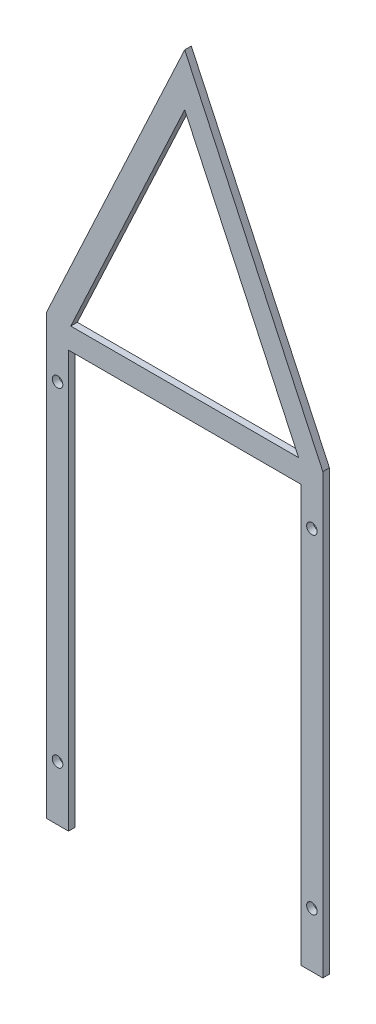
ISO-10303-21;
HEADER;
FILE_DESCRIPTION(('STEP AP214'),'2;1');
FILE_NAME('part.step','',(''),(''),'','','');
FILE_SCHEMA(('AUTOMOTIVE_DESIGN { 1 0 10303 214 1 1 1 1 }'));
ENDSEC;
DATA;
#1=APPLICATION_CONTEXT('core data for automotive mechanical design processes');
#2=APPLICATION_PROTOCOL_DEFINITION('international standard','automotive_design',2000,#1);
#3=PRODUCT_CONTEXT('',#1,'mechanical');
#4=PRODUCT('Part','Part','',(#3));
#5=PRODUCT_RELATED_PRODUCT_CATEGORY('part','',(#4));
#6=PRODUCT_DEFINITION_FORMATION('','',#4);
#7=PRODUCT_DEFINITION_CONTEXT('part definition',#1,'design');
#8=PRODUCT_DEFINITION('design','',#6,#7);
#9=PRODUCT_DEFINITION_SHAPE('','',#8);
#10=(LENGTH_UNIT() NAMED_UNIT(*) SI_UNIT(.MILLI.,.METRE.));
#11=(NAMED_UNIT(*) PLANE_ANGLE_UNIT() SI_UNIT($,.RADIAN.));
#12=(NAMED_UNIT(*) SI_UNIT($,.STERADIAN.) SOLID_ANGLE_UNIT());
#13=UNCERTAINTY_MEASURE_WITH_UNIT(LENGTH_MEASURE(1.E-05),#10,'distance_accuracy_value','');
#14=(GEOMETRIC_REPRESENTATION_CONTEXT(3) GLOBAL_UNCERTAINTY_ASSIGNED_CONTEXT((#13)) GLOBAL_UNIT_ASSIGNED_CONTEXT((#10,
#11,#12)) REPRESENTATION_CONTEXT('',''));
#15=CARTESIAN_POINT('',(0.,0.,0.));
#16=DIRECTION('',(0.,0.,1.));
#17=DIRECTION('',(1.,0.,0.));
#18=AXIS2_PLACEMENT_3D('',#15,#16,#17);
#19=CARTESIAN_POINT('',(0.,0.,1.5));
#20=DIRECTION('',(0.,0.,-1.));
#21=DIRECTION('',(-1.,0.,0.));
#22=AXIS2_PLACEMENT_3D('',#19,#20,#21);
#23=PLANE('',#22);
#24=CARTESIAN_POINT('',(58.,75.,1.5));
#25=DIRECTION('',(0.,0.,1.));
#26=DIRECTION('',(1.,0.,0.));
#27=AXIS2_PLACEMENT_3D('',#24,#25,#26);
#28=CIRCLE('',#27,2.4);
#29=CARTESIAN_POINT('',(60.4,75.,1.5));
#30=VERTEX_POINT('',#29);
#31=EDGE_CURVE('E254',#30,#30,#28,.T.);
#32=ORIENTED_EDGE('',*,*,#31,.F.);
#33=EDGE_LOOP('',(#32));
#34=FACE_BOUND('',#33,.T.);
#35=DIRECTION('',(0.422618261740701,-0.906307787036649,0.));
#36=VECTOR('',#35,1.);
#37=CARTESIAN_POINT('',(51.9662208103751,100.,1.5));
#38=LINE('',#37,#36);
#39=CARTESIAN_POINT('',(0.,211.441920160577,1.5));
#40=VERTEX_POINT('',#39);
#41=CARTESIAN_POINT('',(51.9662208103751,100.,1.5));
#42=VERTEX_POINT('',#41);
#43=EDGE_CURVE('E139',#40,#42,#38,.T.);
#44=ORIENTED_EDGE('',*,*,#43,.T.);
#45=DIRECTION('',(-1.,0.,0.));
#46=VECTOR('',#45,1.);
#47=CARTESIAN_POINT('',(-63.,100.,1.5));
#48=LINE('',#47,#46);
#49=CARTESIAN_POINT('',(-51.966220810375,100.,1.5));
#50=VERTEX_POINT('',#49);
#51=EDGE_CURVE('E56',#42,#50,#48,.T.);
#52=ORIENTED_EDGE('',*,*,#51,.T.);
#53=DIRECTION('',(0.422618261740701,0.906307787036649,0.));
#54=VECTOR('',#53,1.);
#55=CARTESIAN_POINT('',(0.,211.441920160577,1.5));
#56=LINE('',#55,#54);
#57=EDGE_CURVE('E152',#50,#40,#56,.T.);
#58=ORIENTED_EDGE('',*,*,#57,.T.);
#59=EDGE_LOOP('',(#44,#52,#58));
#60=FACE_BOUND('',#59,.T.);
#61=DIRECTION('',(0.,1.,0.));
#62=VECTOR('',#61,1.);
#63=CARTESIAN_POINT('',(63.,-100.,1.5));
#64=LINE('',#63,#62);
#65=CARTESIAN_POINT('',(63.,-100.,1.5));
#66=VERTEX_POINT('',#65);
#67=CARTESIAN_POINT('',(63.,100.,1.5));
#68=VERTEX_POINT('',#67);
#69=EDGE_CURVE('E165',#66,#68,#64,.T.);
#70=ORIENTED_EDGE('',*,*,#69,.T.);
#71=DIRECTION('',(-0.422618261740701,0.906307787036649,0.));
#72=VECTOR('',#71,1.);
#73=CARTESIAN_POINT('',(0.,235.103935992102,1.5));
#74=LINE('',#73,#72);
#75=CARTESIAN_POINT('',(0.,235.103935992102,1.5));
#76=VERTEX_POINT('',#75);
#77=EDGE_CURVE('E148',#68,#76,#74,.T.);
#78=ORIENTED_EDGE('',*,*,#77,.T.);
#79=DIRECTION('',(-0.422618261740701,-0.906307787036649,0.));
#80=VECTOR('',#79,1.);
#81=CARTESIAN_POINT('',(-63.,100.,1.5));
#82=LINE('',#81,#80);
#83=CARTESIAN_POINT('',(-63.,100.,1.5));
#84=VERTEX_POINT('',#83);
#85=EDGE_CURVE('E145',#76,#84,#82,.T.);
#86=ORIENTED_EDGE('',*,*,#85,.T.);
#87=DIRECTION('',(0.,-1.,0.));
#88=VECTOR('',#87,1.);
#89=CARTESIAN_POINT('',(-63.,-100.,1.5));
#90=LINE('',#89,#88);
#91=CARTESIAN_POINT('',(-63.,-100.,1.5));
#92=VERTEX_POINT('',#91);
#93=EDGE_CURVE('E169',#84,#92,#90,.T.);
#94=ORIENTED_EDGE('',*,*,#93,.T.);
#95=DIRECTION('',(1.,0.,0.));
#96=VECTOR('',#95,1.);
#97=CARTESIAN_POINT('',(-63.,-100.,1.5));
#98=LINE('',#97,#96);
#99=CARTESIAN_POINT('',(-53.,-100.,1.5));
#100=VERTEX_POINT('',#99);
#101=EDGE_CURVE('E171',#92,#100,#98,.T.);
#102=ORIENTED_EDGE('',*,*,#101,.T.);
#103=DIRECTION('',(0.,1.,0.));
#104=VECTOR('',#103,1.);
#105=CARTESIAN_POINT('',(-53.,-90.,1.5));
#106=LINE('',#105,#104);
#107=CARTESIAN_POINT('',(-53.,90.,1.5));
#108=VERTEX_POINT('',#107);
#109=EDGE_CURVE('E173',#100,#108,#106,.T.);
#110=ORIENTED_EDGE('',*,*,#109,.T.);
#111=DIRECTION('',(1.,0.,0.));
#112=VECTOR('',#111,1.);
#113=CARTESIAN_POINT('',(-53.,90.,1.5));
#114=LINE('',#113,#112);
#115=CARTESIAN_POINT('',(53.,90.,1.5));
#116=VERTEX_POINT('',#115);
#117=EDGE_CURVE('E175',#108,#116,#114,.T.);
#118=ORIENTED_EDGE('',*,*,#117,.T.);
#119=DIRECTION('',(0.,-1.,0.));
#120=VECTOR('',#119,1.);
#121=CARTESIAN_POINT('',(53.,-90.,1.5));
#122=LINE('',#121,#120);
#123=CARTESIAN_POINT('',(53.,-100.,1.5));
#124=VERTEX_POINT('',#123);
#125=EDGE_CURVE('E177',#116,#124,#122,.T.);
#126=ORIENTED_EDGE('',*,*,#125,.T.);
#127=DIRECTION('',(1.,0.,0.));
#128=VECTOR('',#127,1.);
#129=CARTESIAN_POINT('',(53.,-100.,1.5));
#130=LINE('',#129,#128);
#131=EDGE_CURVE('E179',#124,#66,#130,.T.);
#132=ORIENTED_EDGE('',*,*,#131,.T.);
#133=EDGE_LOOP('',(#70,#78,#86,#94,#102,#110,#118,#126,#132));
#134=FACE_BOUND('',#133,.T.);
#135=CARTESIAN_POINT('',(-58.,75.,1.5));
#136=DIRECTION('',(0.,0.,1.));
#137=DIRECTION('',(1.,0.,0.));
#138=AXIS2_PLACEMENT_3D('',#135,#136,#137);
#139=CIRCLE('',#138,2.4);
#140=CARTESIAN_POINT('',(-55.6,75.,1.5));
#141=VERTEX_POINT('',#140);
#142=EDGE_CURVE('E248',#141,#141,#139,.T.);
#143=ORIENTED_EDGE('',*,*,#142,.F.);
#144=EDGE_LOOP('',(#143));
#145=FACE_BOUND('',#144,.T.);
#146=CARTESIAN_POINT('',(-58.,-75.,1.5));
#147=DIRECTION('',(0.,0.,1.));
#148=DIRECTION('',(1.,0.,0.));
#149=AXIS2_PLACEMENT_3D('',#146,#147,#148);
#150=CIRCLE('',#149,2.4);
#151=CARTESIAN_POINT('',(-55.6,-75.,1.5));
#152=VERTEX_POINT('',#151);
#153=EDGE_CURVE('E260',#152,#152,#150,.T.);
#154=ORIENTED_EDGE('',*,*,#153,.F.);
#155=EDGE_LOOP('',(#154));
#156=FACE_BOUND('',#155,.T.);
#157=CARTESIAN_POINT('',(58.,-75.,1.5));
#158=DIRECTION('',(0.,0.,1.));
#159=DIRECTION('',(1.,0.,0.));
#160=AXIS2_PLACEMENT_3D('',#157,#158,#159);
#161=CIRCLE('',#160,2.4);
#162=CARTESIAN_POINT('',(60.4,-75.,1.5));
#163=VERTEX_POINT('',#162);
#164=EDGE_CURVE('E266',#163,#163,#161,.T.);
#165=ORIENTED_EDGE('',*,*,#164,.F.);
#166=EDGE_LOOP('',(#165));
#167=FACE_BOUND('',#166,.T.);
#168=ADVANCED_FACE('F37',(#34,#60,#134,#145,#156,#167),#23,.F.);
#169=CARTESIAN_POINT('',(63.,-100.,1.5));
#170=DIRECTION('',(-1.,0.,0.));
#171=DIRECTION('',(0.,0.,1.));
#172=AXIS2_PLACEMENT_3D('',#169,#170,#171);
#173=PLANE('',#172);
#174=DIRECTION('',(0.,1.,0.));
#175=VECTOR('',#174,1.);
#176=CARTESIAN_POINT('',(63.,-100.,-1.5));
#177=LINE('',#176,#175);
#178=CARTESIAN_POINT('',(63.,-100.,-1.5));
#179=VERTEX_POINT('',#178);
#180=CARTESIAN_POINT('',(63.,100.,-1.5));
#181=VERTEX_POINT('',#180);
#182=EDGE_CURVE('E164',#179,#181,#177,.T.);
#183=ORIENTED_EDGE('',*,*,#182,.T.);
#184=DIRECTION('',(0.,0.,-1.));
#185=VECTOR('',#184,1.);
#186=CARTESIAN_POINT('',(63.,100.,1.5));
#187=LINE('',#186,#185);
#188=EDGE_CURVE('E11',#68,#181,#187,.T.);
#189=ORIENTED_EDGE('',*,*,#188,.F.);
#190=ORIENTED_EDGE('',*,*,#69,.F.);
#191=DIRECTION('',(0.,0.,-1.));
#192=VECTOR('',#191,1.);
#193=CARTESIAN_POINT('',(63.,-100.,1.5));
#194=LINE('',#193,#192);
#195=EDGE_CURVE('E181',#66,#179,#194,.T.);
#196=ORIENTED_EDGE('',*,*,#195,.T.);
#197=EDGE_LOOP('',(#183,#189,#190,#196));
#198=FACE_BOUND('',#197,.T.);
#199=ADVANCED_FACE('F39',(#198),#173,.F.);
#200=CARTESIAN_POINT('',(-63.,100.,1.5));
#201=DIRECTION('',(0.,-1.,0.));
#202=DIRECTION('',(0.,0.,-1.));
#203=AXIS2_PLACEMENT_3D('',#200,#201,#202);
#204=PLANE('',#203);
#205=DIRECTION('',(-1.,0.,0.));
#206=VECTOR('',#205,1.);
#207=CARTESIAN_POINT('',(-63.,100.,-1.5));
#208=LINE('',#207,#206);
#209=CARTESIAN_POINT('',(51.9662208103751,100.,-1.5));
#210=VERTEX_POINT('',#209);
#211=CARTESIAN_POINT('',(-51.966220810375,100.,-1.5));
#212=VERTEX_POINT('',#211);
#213=EDGE_CURVE('E131',#210,#212,#208,.T.);
#214=ORIENTED_EDGE('',*,*,#213,.T.);
#215=DIRECTION('',(0.,0.,1.));
#216=VECTOR('',#215,1.);
#217=CARTESIAN_POINT('',(-51.966220810375,100.,-186.240557324476));
#218=LINE('',#217,#216);
#219=EDGE_CURVE('E52',#212,#50,#218,.T.);
#220=ORIENTED_EDGE('',*,*,#219,.T.);
#221=ORIENTED_EDGE('',*,*,#51,.F.);
#222=DIRECTION('',(0.,0.,1.));
#223=VECTOR('',#222,1.);
#224=CARTESIAN_POINT('',(51.9662208103751,100.,-186.240557324476));
#225=LINE('',#224,#223);
#226=EDGE_CURVE('E133',#210,#42,#225,.T.);
#227=ORIENTED_EDGE('',*,*,#226,.F.);
#228=EDGE_LOOP('',(#214,#220,#221,#227));
#229=FACE_BOUND('',#228,.T.);
#230=ADVANCED_FACE('F279',(#229),#204,.F.);
#231=CARTESIAN_POINT('',(-63.,-100.,1.5));
#232=DIRECTION('',(1.,0.,0.));
#233=DIRECTION('',(0.,0.,-1.));
#234=AXIS2_PLACEMENT_3D('',#231,#232,#233);
#235=PLANE('',#234);
#236=DIRECTION('',(0.,-1.,0.));
#237=VECTOR('',#236,1.);
#238=CARTESIAN_POINT('',(-63.,-100.,-1.5));
#239=LINE('',#238,#237);
#240=CARTESIAN_POINT('',(-63.,100.,-1.5));
#241=VERTEX_POINT('',#240);
#242=CARTESIAN_POINT('',(-63.,-100.,-1.5));
#243=VERTEX_POINT('',#242);
#244=EDGE_CURVE('E184',#241,#243,#239,.T.);
#245=ORIENTED_EDGE('',*,*,#244,.T.);
#246=DIRECTION('',(0.,0.,-1.));
#247=VECTOR('',#246,1.);
#248=CARTESIAN_POINT('',(-63.,-100.,1.5));
#249=LINE('',#248,#247);
#250=EDGE_CURVE('E211',#92,#243,#249,.T.);
#251=ORIENTED_EDGE('',*,*,#250,.F.);
#252=ORIENTED_EDGE('',*,*,#93,.F.);
#253=DIRECTION('',(0.,0.,-1.));
#254=VECTOR('',#253,1.);
#255=CARTESIAN_POINT('',(-63.,100.,1.5));
#256=LINE('',#255,#254);
#257=EDGE_CURVE('E45',#84,#241,#256,.T.);
#258=ORIENTED_EDGE('',*,*,#257,.T.);
#259=EDGE_LOOP('',(#245,#251,#252,#258));
#260=FACE_BOUND('',#259,.T.);
#261=ADVANCED_FACE('F216',(#260),#235,.F.);
#262=CARTESIAN_POINT('',(-63.,-100.,1.5));
#263=DIRECTION('',(0.,1.,0.));
#264=DIRECTION('',(0.,0.,1.));
#265=AXIS2_PLACEMENT_3D('',#262,#263,#264);
#266=PLANE('',#265);
#267=DIRECTION('',(1.,0.,0.));
#268=VECTOR('',#267,1.);
#269=CARTESIAN_POINT('',(-63.,-100.,-1.5));
#270=LINE('',#269,#268);
#271=CARTESIAN_POINT('',(-53.,-100.,-1.5));
#272=VERTEX_POINT('',#271);
#273=EDGE_CURVE('E186',#243,#272,#270,.T.);
#274=ORIENTED_EDGE('',*,*,#273,.T.);
#275=DIRECTION('',(0.,0.,-1.));
#276=VECTOR('',#275,1.);
#277=CARTESIAN_POINT('',(-53.,-100.,1.5));
#278=LINE('',#277,#276);
#279=EDGE_CURVE('E208',#100,#272,#278,.T.);
#280=ORIENTED_EDGE('',*,*,#279,.F.);
#281=ORIENTED_EDGE('',*,*,#101,.F.);
#282=ORIENTED_EDGE('',*,*,#250,.T.);
#283=EDGE_LOOP('',(#274,#280,#281,#282));
#284=FACE_BOUND('',#283,.T.);
#285=ADVANCED_FACE('F228',(#284),#266,.F.);
#286=CARTESIAN_POINT('',(-53.,-90.,1.5));
#287=DIRECTION('',(-1.,0.,0.));
#288=DIRECTION('',(0.,0.,1.));
#289=AXIS2_PLACEMENT_3D('',#286,#287,#288);
#290=PLANE('',#289);
#291=DIRECTION('',(0.,1.,0.));
#292=VECTOR('',#291,1.);
#293=CARTESIAN_POINT('',(-53.,-90.,-1.5));
#294=LINE('',#293,#292);
#295=CARTESIAN_POINT('',(-53.,90.,-1.5));
#296=VERTEX_POINT('',#295);
#297=EDGE_CURVE('E189',#272,#296,#294,.T.);
#298=ORIENTED_EDGE('',*,*,#297,.T.);
#299=DIRECTION('',(0.,0.,-1.));
#300=VECTOR('',#299,1.);
#301=CARTESIAN_POINT('',(-53.,90.,1.5));
#302=LINE('',#301,#300);
#303=EDGE_CURVE('E205',#108,#296,#302,.T.);
#304=ORIENTED_EDGE('',*,*,#303,.F.);
#305=ORIENTED_EDGE('',*,*,#109,.F.);
#306=ORIENTED_EDGE('',*,*,#279,.T.);
#307=EDGE_LOOP('',(#298,#304,#305,#306));
#308=FACE_BOUND('',#307,.T.);
#309=ADVANCED_FACE('F232',(#308),#290,.F.);
#310=CARTESIAN_POINT('',(-53.,90.,1.5));
#311=DIRECTION('',(0.,1.,0.));
#312=DIRECTION('',(0.,0.,1.));
#313=AXIS2_PLACEMENT_3D('',#310,#311,#312);
#314=PLANE('',#313);
#315=DIRECTION('',(1.,0.,0.));
#316=VECTOR('',#315,1.);
#317=CARTESIAN_POINT('',(-53.,90.,-1.5));
#318=LINE('',#317,#316);
#319=CARTESIAN_POINT('',(53.,90.,-1.5));
#320=VERTEX_POINT('',#319);
#321=EDGE_CURVE('E191',#296,#320,#318,.T.);
#322=ORIENTED_EDGE('',*,*,#321,.T.);
#323=DIRECTION('',(0.,0.,-1.));
#324=VECTOR('',#323,1.);
#325=CARTESIAN_POINT('',(53.,90.,1.5));
#326=LINE('',#325,#324);
#327=EDGE_CURVE('E202',#116,#320,#326,.T.);
#328=ORIENTED_EDGE('',*,*,#327,.F.);
#329=ORIENTED_EDGE('',*,*,#117,.F.);
#330=ORIENTED_EDGE('',*,*,#303,.T.);
#331=EDGE_LOOP('',(#322,#328,#329,#330));
#332=FACE_BOUND('',#331,.T.);
#333=ADVANCED_FACE('F296',(#332),#314,.F.);
#334=CARTESIAN_POINT('',(53.,-90.,1.5));
#335=DIRECTION('',(1.,0.,0.));
#336=DIRECTION('',(0.,1.,0.));
#337=AXIS2_PLACEMENT_3D('',#334,#335,#336);
#338=PLANE('',#337);
#339=DIRECTION('',(0.,-1.,0.));
#340=VECTOR('',#339,1.);
#341=CARTESIAN_POINT('',(53.,-90.,-1.5));
#342=LINE('',#341,#340);
#343=CARTESIAN_POINT('',(53.,-100.,-1.5));
#344=VERTEX_POINT('',#343);
#345=EDGE_CURVE('E194',#320,#344,#342,.T.);
#346=ORIENTED_EDGE('',*,*,#345,.T.);
#347=DIRECTION('',(0.,0.,-1.));
#348=VECTOR('',#347,1.);
#349=CARTESIAN_POINT('',(53.,-100.,1.5));
#350=LINE('',#349,#348);
#351=EDGE_CURVE('E199',#124,#344,#350,.T.);
#352=ORIENTED_EDGE('',*,*,#351,.F.);
#353=ORIENTED_EDGE('',*,*,#125,.F.);
#354=ORIENTED_EDGE('',*,*,#327,.T.);
#355=EDGE_LOOP('',(#346,#352,#353,#354));
#356=FACE_BOUND('',#355,.T.);
#357=ADVANCED_FACE('F292',(#356),#338,.F.);
#358=CARTESIAN_POINT('',(53.,-100.,1.5));
#359=DIRECTION('',(0.,1.,0.));
#360=DIRECTION('',(0.,0.,1.));
#361=AXIS2_PLACEMENT_3D('',#358,#359,#360);
#362=PLANE('',#361);
#363=DIRECTION('',(1.,0.,0.));
#364=VECTOR('',#363,1.);
#365=CARTESIAN_POINT('',(53.,-100.,-1.5));
#366=LINE('',#365,#364);
#367=EDGE_CURVE('E167',#344,#179,#366,.T.);
#368=ORIENTED_EDGE('',*,*,#367,.T.);
#369=ORIENTED_EDGE('',*,*,#195,.F.);
#370=ORIENTED_EDGE('',*,*,#131,.F.);
#371=ORIENTED_EDGE('',*,*,#351,.T.);
#372=EDGE_LOOP('',(#368,#369,#370,#371));
#373=FACE_BOUND('',#372,.T.);
#374=ADVANCED_FACE('F288',(#373),#362,.F.);
#375=CARTESIAN_POINT('',(0.,0.,-1.5));
#376=DIRECTION('',(0.,0.,-1.));
#377=DIRECTION('',(-1.,0.,0.));
#378=AXIS2_PLACEMENT_3D('',#375,#376,#377);
#379=PLANE('',#378);
#380=CARTESIAN_POINT('',(58.,-75.,-1.5));
#381=DIRECTION('',(0.,0.,-1.));
#382=DIRECTION('',(-1.,0.,0.));
#383=AXIS2_PLACEMENT_3D('',#380,#381,#382);
#384=CIRCLE('',#383,2.4);
#385=CARTESIAN_POINT('',(55.6,-75.,-1.5));
#386=VERTEX_POINT('',#385);
#387=EDGE_CURVE('E263',#386,#386,#384,.T.);
#388=ORIENTED_EDGE('',*,*,#387,.F.);
#389=EDGE_LOOP('',(#388));
#390=FACE_BOUND('',#389,.T.);
#391=CARTESIAN_POINT('',(-58.,-75.,-1.5));
#392=DIRECTION('',(0.,0.,-1.));
#393=DIRECTION('',(-1.,0.,0.));
#394=AXIS2_PLACEMENT_3D('',#391,#392,#393);
#395=CIRCLE('',#394,2.4);
#396=CARTESIAN_POINT('',(-60.4,-75.,-1.5));
#397=VERTEX_POINT('',#396);
#398=EDGE_CURVE('E257',#397,#397,#395,.T.);
#399=ORIENTED_EDGE('',*,*,#398,.F.);
#400=EDGE_LOOP('',(#399));
#401=FACE_BOUND('',#400,.T.);
#402=CARTESIAN_POINT('',(58.,75.,-1.5));
#403=DIRECTION('',(0.,0.,-1.));
#404=DIRECTION('',(-1.,0.,0.));
#405=AXIS2_PLACEMENT_3D('',#402,#403,#404);
#406=CIRCLE('',#405,2.4);
#407=CARTESIAN_POINT('',(55.6,75.,-1.5));
#408=VERTEX_POINT('',#407);
#409=EDGE_CURVE('E251',#408,#408,#406,.T.);
#410=ORIENTED_EDGE('',*,*,#409,.F.);
#411=EDGE_LOOP('',(#410));
#412=FACE_BOUND('',#411,.T.);
#413=CARTESIAN_POINT('',(-58.,75.,-1.5));
#414=DIRECTION('',(0.,0.,-1.));
#415=DIRECTION('',(-1.,0.,0.));
#416=AXIS2_PLACEMENT_3D('',#413,#414,#415);
#417=CIRCLE('',#416,2.4);
#418=CARTESIAN_POINT('',(-60.4,75.,-1.5));
#419=VERTEX_POINT('',#418);
#420=EDGE_CURVE('E245',#419,#419,#417,.T.);
#421=ORIENTED_EDGE('',*,*,#420,.F.);
#422=EDGE_LOOP('',(#421));
#423=FACE_BOUND('',#422,.T.);
#424=ORIENTED_EDGE('',*,*,#213,.F.);
#425=DIRECTION('',(0.422618261740701,-0.906307787036649,0.));
#426=VECTOR('',#425,1.);
#427=CARTESIAN_POINT('',(51.9662208103751,100.,-1.5));
#428=LINE('',#427,#426);
#429=CARTESIAN_POINT('',(0.,211.441920160577,-1.50000000000006));
#430=VERTEX_POINT('',#429);
#431=EDGE_CURVE('E125',#430,#210,#428,.T.);
#432=ORIENTED_EDGE('',*,*,#431,.F.);
#433=DIRECTION('',(0.422618261740701,0.906307787036649,0.));
#434=VECTOR('',#433,1.);
#435=CARTESIAN_POINT('',(0.,211.441920160577,-1.5));
#436=LINE('',#435,#434);
#437=EDGE_CURVE('E130',#212,#430,#436,.T.);
#438=ORIENTED_EDGE('',*,*,#437,.F.);
#439=EDGE_LOOP('',(#424,#432,#438));
#440=FACE_BOUND('',#439,.T.);
#441=ORIENTED_EDGE('',*,*,#182,.F.);
#442=ORIENTED_EDGE('',*,*,#367,.F.);
#443=ORIENTED_EDGE('',*,*,#345,.F.);
#444=ORIENTED_EDGE('',*,*,#321,.F.);
#445=ORIENTED_EDGE('',*,*,#297,.F.);
#446=ORIENTED_EDGE('',*,*,#273,.F.);
#447=ORIENTED_EDGE('',*,*,#244,.F.);
#448=DIRECTION('',(-0.422618261740701,-0.906307787036649,0.));
#449=VECTOR('',#448,1.);
#450=CARTESIAN_POINT('',(-63.,100.,-1.5));
#451=LINE('',#450,#449);
#452=CARTESIAN_POINT('',(0.,235.103935992102,-1.5));
#453=VERTEX_POINT('',#452);
#454=EDGE_CURVE('E154',#453,#241,#451,.T.);
#455=ORIENTED_EDGE('',*,*,#454,.F.);
#456=DIRECTION('',(-0.422618261740701,0.906307787036649,0.));
#457=VECTOR('',#456,1.);
#458=CARTESIAN_POINT('',(0.,235.103935992102,-1.5));
#459=LINE('',#458,#457);
#460=EDGE_CURVE('E158',#181,#453,#459,.T.);
#461=ORIENTED_EDGE('',*,*,#460,.F.);
#462=EDGE_LOOP('',(#441,#442,#443,#444,#445,#446,#447,#455,#461));
#463=FACE_BOUND('',#462,.T.);
#464=ADVANCED_FACE('F127',(#390,#401,#412,#423,#440,#463),#379,.T.);
#465=CARTESIAN_POINT('',(0.,211.441920160577,-186.240557324476));
#466=DIRECTION('',(0.906307787036649,-0.422618261740701,0.));
#467=DIRECTION('',(0.422618261740701,0.906307787036649,0.));
#468=AXIS2_PLACEMENT_3D('',#465,#466,#467);
#469=PLANE('',#468);
#470=ORIENTED_EDGE('',*,*,#219,.F.);
#471=ORIENTED_EDGE('',*,*,#437,.T.);
#472=DIRECTION('',(0.,0.,1.));
#473=VECTOR('',#472,1.);
#474=CARTESIAN_POINT('',(0.,211.441920160577,-186.240557324476));
#475=LINE('',#474,#473);
#476=EDGE_CURVE('E134',#430,#40,#475,.T.);
#477=ORIENTED_EDGE('',*,*,#476,.T.);
#478=ORIENTED_EDGE('',*,*,#57,.F.);
#479=EDGE_LOOP('',(#470,#471,#477,#478));
#480=FACE_BOUND('',#479,.T.);
#481=ADVANCED_FACE('F144',(#480),#469,.T.);
#482=CARTESIAN_POINT('',(51.9662208103751,100.,-186.240557324476));
#483=DIRECTION('',(-0.906307787036649,-0.422618261740701,0.));
#484=DIRECTION('',(0.422618261740701,-0.906307787036649,0.));
#485=AXIS2_PLACEMENT_3D('',#482,#483,#484);
#486=PLANE('',#485);
#487=ORIENTED_EDGE('',*,*,#476,.F.);
#488=ORIENTED_EDGE('',*,*,#431,.T.);
#489=ORIENTED_EDGE('',*,*,#226,.T.);
#490=ORIENTED_EDGE('',*,*,#43,.F.);
#491=EDGE_LOOP('',(#487,#488,#489,#490));
#492=FACE_BOUND('',#491,.T.);
#493=ADVANCED_FACE('F137',(#492),#486,.T.);
#494=CARTESIAN_POINT('',(0.,235.103935992102,-186.240557324476));
#495=DIRECTION('',(0.906307787036649,0.422618261740701,0.));
#496=DIRECTION('',(-0.422618261740701,0.906307787036649,0.));
#497=AXIS2_PLACEMENT_3D('',#494,#495,#496);
#498=PLANE('',#497);
#499=ORIENTED_EDGE('',*,*,#188,.T.);
#500=ORIENTED_EDGE('',*,*,#460,.T.);
#501=DIRECTION('',(0.,0.,1.));
#502=VECTOR('',#501,1.);
#503=CARTESIAN_POINT('',(0.,235.103935992102,-186.240557324476));
#504=LINE('',#503,#502);
#505=EDGE_CURVE('E157',#453,#76,#504,.T.);
#506=ORIENTED_EDGE('',*,*,#505,.T.);
#507=ORIENTED_EDGE('',*,*,#77,.F.);
#508=EDGE_LOOP('',(#499,#500,#506,#507));
#509=FACE_BOUND('',#508,.T.);
#510=ADVANCED_FACE('F351',(#509),#498,.T.);
#511=CARTESIAN_POINT('',(-63.,100.,-186.240557324476));
#512=DIRECTION('',(-0.906307787036649,0.422618261740701,0.));
#513=DIRECTION('',(-0.422618261740701,-0.906307787036649,0.));
#514=AXIS2_PLACEMENT_3D('',#511,#512,#513);
#515=PLANE('',#514);
#516=ORIENTED_EDGE('',*,*,#505,.F.);
#517=ORIENTED_EDGE('',*,*,#454,.T.);
#518=ORIENTED_EDGE('',*,*,#257,.F.);
#519=ORIENTED_EDGE('',*,*,#85,.F.);
#520=EDGE_LOOP('',(#516,#517,#518,#519));
#521=FACE_BOUND('',#520,.T.);
#522=ADVANCED_FACE('F221',(#521),#515,.T.);
#523=CARTESIAN_POINT('',(-58.,75.,1.5));
#524=DIRECTION('',(0.,0.,1.));
#525=DIRECTION('',(1.,0.,0.));
#526=AXIS2_PLACEMENT_3D('',#523,#524,#525);
#527=CYLINDRICAL_SURFACE('',#526,2.4);
#528=ORIENTED_EDGE('',*,*,#142,.T.);
#529=EDGE_LOOP('',(#528));
#530=FACE_BOUND('',#529,.T.);
#531=ORIENTED_EDGE('',*,*,#420,.T.);
#532=EDGE_LOOP('',(#531));
#533=FACE_BOUND('',#532,.T.);
#534=ADVANCED_FACE('F363',(#530,#533),#527,.F.);
#535=CARTESIAN_POINT('',(58.,75.,1.5));
#536=DIRECTION('',(0.,0.,1.));
#537=DIRECTION('',(1.,0.,0.));
#538=AXIS2_PLACEMENT_3D('',#535,#536,#537);
#539=CYLINDRICAL_SURFACE('',#538,2.4);
#540=ORIENTED_EDGE('',*,*,#31,.T.);
#541=EDGE_LOOP('',(#540));
#542=FACE_BOUND('',#541,.T.);
#543=ORIENTED_EDGE('',*,*,#409,.T.);
#544=EDGE_LOOP('',(#543));
#545=FACE_BOUND('',#544,.T.);
#546=ADVANCED_FACE('F370',(#542,#545),#539,.F.);
#547=CARTESIAN_POINT('',(-58.,-75.,1.5));
#548=DIRECTION('',(0.,0.,1.));
#549=DIRECTION('',(1.,0.,0.));
#550=AXIS2_PLACEMENT_3D('',#547,#548,#549);
#551=CYLINDRICAL_SURFACE('',#550,2.4);
#552=ORIENTED_EDGE('',*,*,#153,.T.);
#553=EDGE_LOOP('',(#552));
#554=FACE_BOUND('',#553,.T.);
#555=ORIENTED_EDGE('',*,*,#398,.T.);
#556=EDGE_LOOP('',(#555));
#557=FACE_BOUND('',#556,.T.);
#558=ADVANCED_FACE('F377',(#554,#557),#551,.F.);
#559=CARTESIAN_POINT('',(58.,-75.,1.5));
#560=DIRECTION('',(0.,0.,1.));
#561=DIRECTION('',(1.,0.,0.));
#562=AXIS2_PLACEMENT_3D('',#559,#560,#561);
#563=CYLINDRICAL_SURFACE('',#562,2.4);
#564=ORIENTED_EDGE('',*,*,#164,.T.);
#565=EDGE_LOOP('',(#564));
#566=FACE_BOUND('',#565,.T.);
#567=ORIENTED_EDGE('',*,*,#387,.T.);
#568=EDGE_LOOP('',(#567));
#569=FACE_BOUND('',#568,.T.);
#570=ADVANCED_FACE('F270',(#566,#569),#563,.F.);
#571=CLOSED_SHELL('',(#168,#199,#230,#261,#285,#309,#333,#357,#374,#464,#481,#493,#510,#522,
#534,#546,#558,#570));
#572=MANIFOLD_SOLID_BREP('B2',#571);
#573=ADVANCED_BREP_SHAPE_REPRESENTATION('',(#18,#572),#14);
#574=SHAPE_DEFINITION_REPRESENTATION(#9,#573);
ENDSEC;
END-ISO-10303-21;
